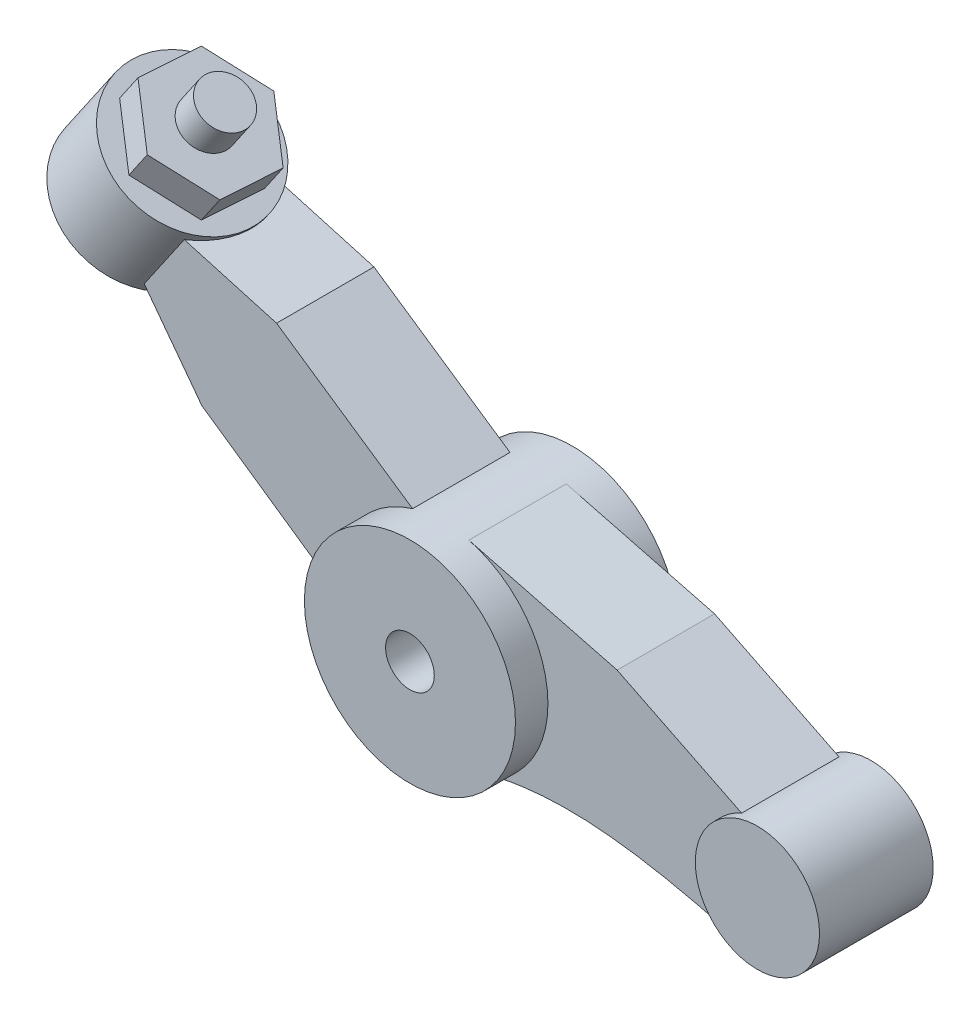
ISO-10303-21;
HEADER;
FILE_DESCRIPTION(('STEP AP214'),'2;1');
FILE_NAME('part.step','',(''),(''),'','','');
FILE_SCHEMA(('AUTOMOTIVE_DESIGN { 1 0 10303 214 1 1 1 1 }'));
ENDSEC;
DATA;
#1=APPLICATION_CONTEXT('core data for automotive mechanical design processes');
#2=APPLICATION_PROTOCOL_DEFINITION('international standard','automotive_design',2000,#1);
#3=PRODUCT_CONTEXT('',#1,'mechanical');
#4=PRODUCT('Part','Part','',(#3));
#5=PRODUCT_RELATED_PRODUCT_CATEGORY('part','',(#4));
#6=PRODUCT_DEFINITION_FORMATION('','',#4);
#7=PRODUCT_DEFINITION_CONTEXT('part definition',#1,'design');
#8=PRODUCT_DEFINITION('design','',#6,#7);
#9=PRODUCT_DEFINITION_SHAPE('','',#8);
#10=(LENGTH_UNIT() NAMED_UNIT(*) SI_UNIT(.MILLI.,.METRE.));
#11=(NAMED_UNIT(*) PLANE_ANGLE_UNIT() SI_UNIT($,.RADIAN.));
#12=(NAMED_UNIT(*) SI_UNIT($,.STERADIAN.) SOLID_ANGLE_UNIT());
#13=UNCERTAINTY_MEASURE_WITH_UNIT(LENGTH_MEASURE(1.E-05),#10,'distance_accuracy_value','');
#14=(GEOMETRIC_REPRESENTATION_CONTEXT(3) GLOBAL_UNCERTAINTY_ASSIGNED_CONTEXT((#13)) GLOBAL_UNIT_ASSIGNED_CONTEXT((#10,
#11,#12)) REPRESENTATION_CONTEXT('',''));
#15=CARTESIAN_POINT('',(0.,0.,0.));
#16=DIRECTION('',(0.,0.,1.));
#17=DIRECTION('',(1.,0.,0.));
#18=AXIS2_PLACEMENT_3D('',#15,#16,#17);
#19=CARTESIAN_POINT('',(-3.24568961540664,3.85924695439901,0.0311809802771275));
#20=DIRECTION('',(-0.565974647839502,-0.824422645251179,0.));
#21=DIRECTION('',(0.824422645251179,-0.565974647839503,0.));
#22=AXIS2_PLACEMENT_3D('',#19,#20,#21);
#23=CYLINDRICAL_SURFACE('',#22,0.3);
#24=CARTESIAN_POINT('',(-3.24568961540664,3.85924695439901,0.0311809802771275));
#25=DIRECTION('',(0.565974647839502,0.824422645251179,0.));
#26=DIRECTION('',(-0.824422645251179,0.565974647839503,0.));
#27=AXIS2_PLACEMENT_3D('',#24,#25,#26);
#28=CIRCLE('',#27,0.3);
#29=CARTESIAN_POINT('',(-3.493016408982,4.02903934875086,0.0311809802771275));
#30=VERTEX_POINT('',#29);
#31=EDGE_CURVE('E11',#30,#30,#28,.T.);
#32=ORIENTED_EDGE('',*,*,#31,.F.);
#33=EDGE_LOOP('',(#32));
#34=FACE_BOUND('',#33,.T.);
#35=CARTESIAN_POINT('',(-3.47207947454244,3.52947789629854,0.0311809802771275));
#36=DIRECTION('',(0.565974647839502,0.824422645251179,0.));
#37=DIRECTION('',(-0.824422645251179,0.565974647839503,0.));
#38=AXIS2_PLACEMENT_3D('',#35,#36,#37);
#39=CIRCLE('',#38,0.3);
#40=CARTESIAN_POINT('',(-3.7194062681178,3.69927029065039,0.0311809802771275));
#41=VERTEX_POINT('',#40);
#42=EDGE_CURVE('E47',#41,#41,#39,.T.);
#43=ORIENTED_EDGE('',*,*,#42,.T.);
#44=EDGE_LOOP('',(#43));
#45=FACE_BOUND('',#44,.T.);
#46=ADVANCED_FACE('F44',(#34,#45),#23,.T.);
#47=CARTESIAN_POINT('',(-3.24568961540664,3.85924695439901,0.0311809802771275));
#48=DIRECTION('',(0.565974647839502,0.824422645251179,0.));
#49=DIRECTION('',(-0.824422645251179,0.565974647839503,0.));
#50=AXIS2_PLACEMENT_3D('',#47,#48,#49);
#51=PLANE('',#50);
#52=ORIENTED_EDGE('',*,*,#31,.T.);
#53=EDGE_LOOP('',(#52));
#54=FACE_BOUND('',#53,.T.);
#55=ADVANCED_FACE('F59',(#54),#51,.T.);
#56=CARTESIAN_POINT('',(-3.47207947454244,3.52947789629854,0.0311809802771275));
#57=DIRECTION('',(0.565974647839502,0.824422645251179,0.));
#58=DIRECTION('',(-0.824422645251179,0.565974647839503,0.));
#59=AXIS2_PLACEMENT_3D('',#56,#57,#58);
#60=PLANE('',#59);
#61=ORIENTED_EDGE('',*,*,#42,.F.);
#62=EDGE_LOOP('',(#61));
#63=FACE_BOUND('',#62,.T.);
#64=ADVANCED_FACE('F57',(#63),#60,.F.);
#65=CLOSED_SHELL('',(#46,#55,#64));
#66=MANIFOLD_SOLID_BREP('B2',#65);
#67=CARTESIAN_POINT('',(-3.48522797726976,3.53850447901504,0.749691266650442));
#68=DIRECTION('',(-0.377487046578813,0.259148750318868,-0.889013754040608));
#69=DIRECTION('',(-0.920459006911347,0.,0.390839118558745));
#70=AXIS2_PLACEMENT_3D('',#67,#68,#69);
#71=PLANE('',#70);
#72=DIRECTION('',(0.732923070770839,-0.503159246367607,-0.457880492188329));
#73=VECTOR('',#72,1.);
#74=CARTESIAN_POINT('',(-3.71161783640557,3.20873542091457,0.749691266650442));
#75=LINE('',#74,#73);
#76=CARTESIAN_POINT('',(-3.71161783640557,3.20873542091457,0.749691266650442));
#77=VERTEX_POINT('',#76);
#78=CARTESIAN_POINT('',(-3.16151850453929,2.8310865566783,0.406026613602348));
#79=VERTEX_POINT('',#78);
#80=EDGE_CURVE('E182',#77,#79,#75,.T.);
#81=ORIENTED_EDGE('',*,*,#80,.T.);
#82=DIRECTION('',(-0.565974647839503,-0.824422645251179,0.));
#83=VECTOR('',#82,1.);
#84=CARTESIAN_POINT('',(-2.93512864540348,3.16085561477877,0.406026613602348));
#85=LINE('',#84,#83);
#86=CARTESIAN_POINT('',(-2.93512864540348,3.16085561477877,0.406026613602348));
#87=VERTEX_POINT('',#86);
#88=EDGE_CURVE('E42',#87,#79,#85,.T.);
#89=ORIENTED_EDGE('',*,*,#88,.F.);
#90=DIRECTION('',(0.732923070770839,-0.503159246367607,-0.457880492188329));
#91=VECTOR('',#90,1.);
#92=CARTESIAN_POINT('',(-3.48522797726976,3.53850447901504,0.749691266650442));
#93=LINE('',#92,#91);
#94=CARTESIAN_POINT('',(-3.48522797726976,3.53850447901504,0.749691266650442));
#95=VERTEX_POINT('',#94);
#96=EDGE_CURVE('E192',#95,#87,#93,.T.);
#97=ORIENTED_EDGE('',*,*,#96,.F.);
#98=DIRECTION('',(-0.565974647839503,-0.824422645251179,0.));
#99=VECTOR('',#98,1.);
#100=CARTESIAN_POINT('',(-3.48522797726976,3.53850447901504,0.749691266650442));
#101=LINE('',#100,#99);
#102=EDGE_CURVE('E178',#95,#77,#101,.T.);
#103=ORIENTED_EDGE('',*,*,#102,.T.);
#104=EDGE_LOOP('',(#81,#89,#97,#103));
#105=FACE_BOUND('',#104,.T.);
#106=ADVANCED_FACE('F98',(#105),#71,.F.);
#107=CARTESIAN_POINT('',(-2.93512864540348,3.16085561477877,0.406026613602348));
#108=DIRECTION('',(-0.823473521596653,0.565323064662815,-0.0479707388878877));
#109=DIRECTION('',(-0.565974647839503,-0.824422645251179,0.));
#110=AXIS2_PLACEMENT_3D('',#107,#108,#109);
#111=PLANE('',#110);
#112=DIRECTION('',(0.0395481634486059,-0.0271502220486731,-0.998848741407101));
#113=VECTOR('',#112,1.);
#114=CARTESIAN_POINT('',(-3.16151850453929,2.8310865566783,0.406026613602348));
#115=LINE('',#114,#113);
#116=CARTESIAN_POINT('',(-3.13183541888237,2.81070881226743,-0.343664653048093));
#117=VERTEX_POINT('',#116);
#118=EDGE_CURVE('E185',#79,#117,#115,.T.);
#119=ORIENTED_EDGE('',*,*,#118,.T.);
#120=DIRECTION('',(-0.565974647839503,-0.824422645251179,0.));
#121=VECTOR('',#120,1.);
#122=CARTESIAN_POINT('',(-2.90544555974657,3.14047787036791,-0.343664653048093));
#123=LINE('',#122,#121);
#124=CARTESIAN_POINT('',(-2.90544555974657,3.14047787036791,-0.343664653048093));
#125=VERTEX_POINT('',#124);
#126=EDGE_CURVE('E106',#125,#117,#123,.T.);
#127=ORIENTED_EDGE('',*,*,#126,.F.);
#128=DIRECTION('',(0.0395481634486059,-0.0271502220486731,-0.998848741407101));
#129=VECTOR('',#128,1.);
#130=CARTESIAN_POINT('',(-2.93512864540348,3.16085561477877,0.406026613602348));
#131=LINE('',#130,#129);
#132=EDGE_CURVE('E151',#87,#125,#131,.T.);
#133=ORIENTED_EDGE('',*,*,#132,.F.);
#134=ORIENTED_EDGE('',*,*,#88,.T.);
#135=EDGE_LOOP('',(#119,#127,#133,#134));
#136=FACE_BOUND('',#135,.T.);
#137=ADVANCED_FACE('F216',(#136),#111,.F.);
#138=CARTESIAN_POINT('',(-2.90544555974657,3.14047787036791,-0.343664653048093));
#139=DIRECTION('',(-0.445986475017839,0.306174314343947,0.841043015152719));
#140=DIRECTION('',(0.8834713126073,0.,0.468485261027424));
#141=AXIS2_PLACEMENT_3D('',#138,#139,#140);
#142=PLANE('',#141);
#143=DIRECTION('',(-0.693374907322231,0.476009024318934,-0.540968249218772));
#144=VECTOR('',#143,1.);
#145=CARTESIAN_POINT('',(-3.13183541888237,2.81070881226743,-0.343664653048093));
#146=LINE('',#145,#144);
#147=CARTESIAN_POINT('',(-3.65225166509174,3.16797993209283,-0.749691266650442));
#148=VERTEX_POINT('',#147);
#149=EDGE_CURVE('E187',#117,#148,#146,.T.);
#150=ORIENTED_EDGE('',*,*,#149,.T.);
#151=DIRECTION('',(-0.565974647839503,-0.824422645251179,0.));
#152=VECTOR('',#151,1.);
#153=CARTESIAN_POINT('',(-3.42586180595594,3.4977489901933,-0.749691266650442));
#154=LINE('',#153,#152);
#155=CARTESIAN_POINT('',(-3.42586180595594,3.4977489901933,-0.749691266650442));
#156=VERTEX_POINT('',#155);
#157=EDGE_CURVE('E173',#156,#148,#154,.T.);
#158=ORIENTED_EDGE('',*,*,#157,.F.);
#159=DIRECTION('',(-0.693374907322231,0.476009024318934,-0.540968249218772));
#160=VECTOR('',#159,1.);
#161=CARTESIAN_POINT('',(-2.90544555974657,3.14047787036791,-0.343664653048093));
#162=LINE('',#161,#160);
#163=EDGE_CURVE('E164',#125,#156,#162,.T.);
#164=ORIENTED_EDGE('',*,*,#163,.F.);
#165=ORIENTED_EDGE('',*,*,#126,.T.);
#166=EDGE_LOOP('',(#150,#158,#164,#165));
#167=FACE_BOUND('',#166,.T.);
#168=ADVANCED_FACE('F198',(#167),#142,.F.);
#169=CARTESIAN_POINT('',(-3.42586180595594,3.4977489901933,-0.749691266650442));
#170=DIRECTION('',(0.377487046578814,-0.259148750318868,0.889013754040607));
#171=DIRECTION('',(0.920459006911347,0.,-0.390839118558745));
#172=AXIS2_PLACEMENT_3D('',#169,#170,#171);
#173=PLANE('',#172);
#174=DIRECTION('',(-0.732923070770838,0.503159246367607,0.457880492188329));
#175=VECTOR('',#174,1.);
#176=CARTESIAN_POINT('',(-3.65225166509174,3.16797993209283,-0.749691266650442));
#177=LINE('',#176,#175);
#178=CARTESIAN_POINT('',(-4.20235099695802,3.54562879632909,-0.406026613602349));
#179=VERTEX_POINT('',#178);
#180=EDGE_CURVE('E172',#148,#179,#177,.T.);
#181=ORIENTED_EDGE('',*,*,#180,.T.);
#182=DIRECTION('',(-0.565974647839503,-0.824422645251179,0.));
#183=VECTOR('',#182,1.);
#184=CARTESIAN_POINT('',(-3.97596113782222,3.87539785442957,-0.406026613602349));
#185=LINE('',#184,#183);
#186=CARTESIAN_POINT('',(-3.97596113782222,3.87539785442957,-0.406026613602349));
#187=VERTEX_POINT('',#186);
#188=EDGE_CURVE('E169',#187,#179,#185,.T.);
#189=ORIENTED_EDGE('',*,*,#188,.F.);
#190=DIRECTION('',(-0.732923070770838,0.503159246367607,0.457880492188329));
#191=VECTOR('',#190,1.);
#192=CARTESIAN_POINT('',(-3.42586180595594,3.4977489901933,-0.749691266650442));
#193=LINE('',#192,#191);
#194=EDGE_CURVE('E158',#156,#187,#193,.T.);
#195=ORIENTED_EDGE('',*,*,#194,.F.);
#196=ORIENTED_EDGE('',*,*,#157,.T.);
#197=EDGE_LOOP('',(#181,#189,#195,#196));
#198=FACE_BOUND('',#197,.T.);
#199=ADVANCED_FACE('F170',(#198),#173,.F.);
#200=CARTESIAN_POINT('',(-3.97596113782222,3.87539785442957,-0.406026613602349));
#201=DIRECTION('',(0.823473521596653,-0.565323064662815,0.0479707388878887));
#202=DIRECTION('',(0.565974647839503,0.824422645251179,0.));
#203=AXIS2_PLACEMENT_3D('',#200,#201,#202);
#204=PLANE('',#203);
#205=DIRECTION('',(-0.0395481634486071,0.0271502220486731,0.998848741407101));
#206=VECTOR('',#205,1.);
#207=CARTESIAN_POINT('',(-4.20235099695802,3.54562879632909,-0.406026613602349));
#208=LINE('',#207,#206);
#209=CARTESIAN_POINT('',(-4.23203408261493,3.56600654073996,0.343664653048093));
#210=VERTEX_POINT('',#209);
#211=EDGE_CURVE('E137',#179,#210,#208,.T.);
#212=ORIENTED_EDGE('',*,*,#211,.T.);
#213=DIRECTION('',(-0.565974647839503,-0.824422645251179,0.));
#214=VECTOR('',#213,1.);
#215=CARTESIAN_POINT('',(-4.00564422347913,3.89577559884043,0.343664653048093));
#216=LINE('',#215,#214);
#217=CARTESIAN_POINT('',(-4.00564422347913,3.89577559884043,0.343664653048093));
#218=VERTEX_POINT('',#217);
#219=EDGE_CURVE('E174',#218,#210,#216,.T.);
#220=ORIENTED_EDGE('',*,*,#219,.F.);
#221=DIRECTION('',(-0.0395481634486071,0.0271502220486731,0.998848741407101));
#222=VECTOR('',#221,1.);
#223=CARTESIAN_POINT('',(-3.97596113782222,3.87539785442957,-0.406026613602349));
#224=LINE('',#223,#222);
#225=EDGE_CURVE('E162',#187,#218,#224,.T.);
#226=ORIENTED_EDGE('',*,*,#225,.F.);
#227=ORIENTED_EDGE('',*,*,#188,.T.);
#228=EDGE_LOOP('',(#212,#220,#226,#227));
#229=FACE_BOUND('',#228,.T.);
#230=ADVANCED_FACE('F176',(#229),#204,.F.);
#231=CARTESIAN_POINT('',(-4.00564422347913,3.89577559884043,0.343664653048093));
#232=DIRECTION('',(0.445986475017839,-0.306174314343947,-0.841043015152719));
#233=DIRECTION('',(-0.8834713126073,0.,-0.468485261027424));
#234=AXIS2_PLACEMENT_3D('',#231,#232,#233);
#235=PLANE('',#234);
#236=DIRECTION('',(0.693374907322231,-0.476009024318934,0.540968249218773));
#237=VECTOR('',#236,1.);
#238=CARTESIAN_POINT('',(-4.23203408261493,3.56600654073996,0.343664653048093));
#239=LINE('',#238,#237);
#240=EDGE_CURVE('E143',#210,#77,#239,.T.);
#241=ORIENTED_EDGE('',*,*,#240,.T.);
#242=ORIENTED_EDGE('',*,*,#102,.F.);
#243=DIRECTION('',(0.693374907322231,-0.476009024318934,0.540968249218773));
#244=VECTOR('',#243,1.);
#245=CARTESIAN_POINT('',(-4.00564422347913,3.89577559884043,0.343664653048093));
#246=LINE('',#245,#244);
#247=EDGE_CURVE('E114',#218,#95,#246,.T.);
#248=ORIENTED_EDGE('',*,*,#247,.F.);
#249=ORIENTED_EDGE('',*,*,#219,.T.);
#250=EDGE_LOOP('',(#241,#242,#248,#249));
#251=FACE_BOUND('',#250,.T.);
#252=ADVANCED_FACE('F205',(#251),#235,.F.);
#253=CARTESIAN_POINT('',(0.534660711402853,0.778809439060978,0.));
#254=DIRECTION('',(0.565974647839502,0.824422645251179,0.));
#255=DIRECTION('',(-0.824422645251179,0.565974647839502,0.));
#256=AXIS2_PLACEMENT_3D('',#253,#254,#255);
#257=PLANE('',#256);
#258=ORIENTED_EDGE('',*,*,#96,.T.);
#259=ORIENTED_EDGE('',*,*,#132,.T.);
#260=ORIENTED_EDGE('',*,*,#163,.T.);
#261=ORIENTED_EDGE('',*,*,#194,.T.);
#262=ORIENTED_EDGE('',*,*,#225,.T.);
#263=ORIENTED_EDGE('',*,*,#247,.T.);
#264=EDGE_LOOP('',(#258,#259,#260,#261,#262,#263));
#265=FACE_BOUND('',#264,.T.);
#266=ADVANCED_FACE('F160',(#265),#257,.T.);
#267=CARTESIAN_POINT('',(0.308270852267052,0.449040380960506,0.));
#268=DIRECTION('',(0.565974647839502,0.824422645251179,0.));
#269=DIRECTION('',(-0.824422645251179,0.565974647839502,0.));
#270=AXIS2_PLACEMENT_3D('',#267,#268,#269);
#271=PLANE('',#270);
#272=ORIENTED_EDGE('',*,*,#80,.F.);
#273=ORIENTED_EDGE('',*,*,#240,.F.);
#274=ORIENTED_EDGE('',*,*,#211,.F.);
#275=ORIENTED_EDGE('',*,*,#180,.F.);
#276=ORIENTED_EDGE('',*,*,#149,.F.);
#277=ORIENTED_EDGE('',*,*,#118,.F.);
#278=EDGE_LOOP('',(#272,#273,#274,#275,#276,#277));
#279=FACE_BOUND('',#278,.T.);
#280=ADVANCED_FACE('F201',(#279),#271,.F.);
#281=CLOSED_SHELL('',(#106,#137,#168,#199,#230,#252,#266,#280));
#282=MANIFOLD_SOLID_BREP('B6',#281);
#283=CARTESIAN_POINT('',(0.,0.,1.));
#284=DIRECTION('',(0.,0.,-1.));
#285=DIRECTION('',(-1.,0.,0.));
#286=AXIS2_PLACEMENT_3D('',#283,#284,#285);
#287=CYLINDRICAL_SURFACE('',#286,0.3);
#288=CARTESIAN_POINT('',(0.,0.,1.));
#289=DIRECTION('',(0.,0.,1.));
#290=DIRECTION('',(1.,0.,0.));
#291=AXIS2_PLACEMENT_3D('',#288,#289,#290);
#292=CIRCLE('',#291,0.3);
#293=CARTESIAN_POINT('',(0.3,0.,1.));
#294=VERTEX_POINT('',#293);
#295=EDGE_CURVE('E455',#294,#294,#292,.T.);
#296=ORIENTED_EDGE('',*,*,#295,.T.);
#297=EDGE_LOOP('',(#296));
#298=FACE_BOUND('',#297,.T.);
#299=CARTESIAN_POINT('',(0.,0.,-1.));
#300=DIRECTION('',(0.,0.,1.));
#301=DIRECTION('',(1.,0.,0.));
#302=AXIS2_PLACEMENT_3D('',#299,#300,#301);
#303=CIRCLE('',#302,0.3);
#304=CARTESIAN_POINT('',(0.3,0.,-1.));
#305=VERTEX_POINT('',#304);
#306=EDGE_CURVE('E456',#305,#305,#303,.T.);
#307=ORIENTED_EDGE('',*,*,#306,.F.);
#308=EDGE_LOOP('',(#307));
#309=FACE_BOUND('',#308,.T.);
#310=ADVANCED_FACE('F286',(#298,#309),#287,.F.);
#311=CARTESIAN_POINT('',(0.,0.,1.));
#312=DIRECTION('',(0.,0.,-1.));
#313=DIRECTION('',(-1.,0.,0.));
#314=AXIS2_PLACEMENT_3D('',#311,#312,#313);
#315=CYLINDRICAL_SURFACE('',#314,1.3);
#316=DIRECTION('',(0.,0.,-1.));
#317=VECTOR('',#316,1.);
#318=CARTESIAN_POINT('',(-0.367546709514205,1.2469600700605,0.6));
#319=LINE('',#318,#317);
#320=CARTESIAN_POINT('',(-0.367546709514206,1.2469600700605,0.6));
#321=VERTEX_POINT('',#320);
#322=CARTESIAN_POINT('',(-0.367546709514206,1.2469600700605,-0.6));
#323=VERTEX_POINT('',#322);
#324=EDGE_CURVE('E308',#321,#323,#319,.T.);
#325=ORIENTED_EDGE('',*,*,#324,.F.);
#326=CARTESIAN_POINT('',(0.,0.,0.6));
#327=DIRECTION('',(0.,0.,1.));
#328=DIRECTION('',(1.,0.,0.));
#329=AXIS2_PLACEMENT_3D('',#326,#327,#328);
#330=CIRCLE('',#329,1.3);
#331=CARTESIAN_POINT('',(-1.29574513197099,-0.105093068151436,0.6));
#332=VERTEX_POINT('',#331);
#333=EDGE_CURVE('E389',#321,#332,#330,.T.);
#334=ORIENTED_EDGE('',*,*,#333,.T.);
#335=DIRECTION('',(0.,0.,-1.));
#336=VECTOR('',#335,1.);
#337=CARTESIAN_POINT('',(-1.29574513197099,-0.105093068151436,0.6));
#338=LINE('',#337,#336);
#339=CARTESIAN_POINT('',(-1.29574513197099,-0.105093068151436,-0.6));
#340=VERTEX_POINT('',#339);
#341=EDGE_CURVE('E395',#332,#340,#338,.T.);
#342=ORIENTED_EDGE('',*,*,#341,.T.);
#343=CARTESIAN_POINT('',(0.,0.,-0.6));
#344=DIRECTION('',(0.,0.,1.));
#345=DIRECTION('',(1.,0.,0.));
#346=AXIS2_PLACEMENT_3D('',#343,#344,#345);
#347=CIRCLE('',#346,1.3);
#348=EDGE_CURVE('E593',#323,#340,#347,.T.);
#349=ORIENTED_EDGE('',*,*,#348,.F.);
#350=EDGE_LOOP('',(#325,#334,#342,#349));
#351=FACE_BOUND('',#350,.T.);
#352=DIRECTION('',(0.,0.,-1.));
#353=VECTOR('',#352,1.);
#354=CARTESIAN_POINT('',(0.709115587174983,-1.08956646608891,0.6));
#355=LINE('',#354,#353);
#356=CARTESIAN_POINT('',(0.709115587174983,-1.08956646608891,0.6));
#357=VERTEX_POINT('',#356);
#358=CARTESIAN_POINT('',(0.709115587174983,-1.08956646608891,-0.6));
#359=VERTEX_POINT('',#358);
#360=EDGE_CURVE('E447',#357,#359,#355,.T.);
#361=ORIENTED_EDGE('',*,*,#360,.F.);
#362=CARTESIAN_POINT('',(0.,0.,0.6));
#363=DIRECTION('',(0.,0.,1.));
#364=DIRECTION('',(1.,0.,0.));
#365=AXIS2_PLACEMENT_3D('',#362,#363,#364);
#366=CIRCLE('',#365,1.3);
#367=CARTESIAN_POINT('',(0.325958313102532,1.25847176294081,0.6));
#368=VERTEX_POINT('',#367);
#369=EDGE_CURVE('E474',#357,#368,#366,.T.);
#370=ORIENTED_EDGE('',*,*,#369,.T.);
#371=DIRECTION('',(0.,0.,-1.));
#372=VECTOR('',#371,1.);
#373=CARTESIAN_POINT('',(0.325958313102531,1.25847176294081,0.6));
#374=LINE('',#373,#372);
#375=CARTESIAN_POINT('',(0.325958313102531,1.25847176294081,-0.6));
#376=VERTEX_POINT('',#375);
#377=EDGE_CURVE('E471',#368,#376,#374,.T.);
#378=ORIENTED_EDGE('',*,*,#377,.T.);
#379=CARTESIAN_POINT('',(0.,0.,-0.6));
#380=DIRECTION('',(0.,0.,1.));
#381=DIRECTION('',(1.,0.,0.));
#382=AXIS2_PLACEMENT_3D('',#379,#380,#381);
#383=CIRCLE('',#382,1.3);
#384=EDGE_CURVE('E418',#359,#376,#383,.T.);
#385=ORIENTED_EDGE('',*,*,#384,.F.);
#386=EDGE_LOOP('',(#361,#370,#378,#385));
#387=FACE_BOUND('',#386,.T.);
#388=CARTESIAN_POINT('',(0.,0.,1.));
#389=DIRECTION('',(0.,0.,1.));
#390=DIRECTION('',(1.,0.,0.));
#391=AXIS2_PLACEMENT_3D('',#388,#389,#390);
#392=CIRCLE('',#391,1.3);
#393=CARTESIAN_POINT('',(1.3,0.,1.));
#394=VERTEX_POINT('',#393);
#395=EDGE_CURVE('E294',#394,#394,#392,.T.);
#396=ORIENTED_EDGE('',*,*,#395,.F.);
#397=EDGE_LOOP('',(#396));
#398=FACE_BOUND('',#397,.T.);
#399=CARTESIAN_POINT('',(0.,0.,-1.));
#400=DIRECTION('',(0.,0.,1.));
#401=DIRECTION('',(1.,0.,0.));
#402=AXIS2_PLACEMENT_3D('',#399,#400,#401);
#403=CIRCLE('',#402,1.3);
#404=CARTESIAN_POINT('',(1.3,0.,-1.));
#405=VERTEX_POINT('',#404);
#406=EDGE_CURVE('E453',#405,#405,#403,.T.);
#407=ORIENTED_EDGE('',*,*,#406,.T.);
#408=EDGE_LOOP('',(#407));
#409=FACE_BOUND('',#408,.T.);
#410=ADVANCED_FACE('F435',(#351,#387,#398,#409),#315,.T.);
#411=CARTESIAN_POINT('',(0.,0.,1.));
#412=DIRECTION('',(0.,0.,1.));
#413=DIRECTION('',(1.,0.,0.));
#414=AXIS2_PLACEMENT_3D('',#411,#412,#413);
#415=PLANE('',#414);
#416=ORIENTED_EDGE('',*,*,#295,.F.);
#417=EDGE_LOOP('',(#416));
#418=FACE_BOUND('',#417,.T.);
#419=ORIENTED_EDGE('',*,*,#395,.T.);
#420=EDGE_LOOP('',(#419));
#421=FACE_BOUND('',#420,.T.);
#422=ADVANCED_FACE('F432',(#418,#421),#415,.T.);
#423=CARTESIAN_POINT('',(0.,0.,-1.));
#424=DIRECTION('',(0.,0.,1.));
#425=DIRECTION('',(1.,0.,0.));
#426=AXIS2_PLACEMENT_3D('',#423,#424,#425);
#427=PLANE('',#426);
#428=ORIENTED_EDGE('',*,*,#306,.T.);
#429=EDGE_LOOP('',(#428));
#430=FACE_BOUND('',#429,.T.);
#431=ORIENTED_EDGE('',*,*,#406,.F.);
#432=EDGE_LOOP('',(#431));
#433=FACE_BOUND('',#432,.T.);
#434=ADVANCED_FACE('F429',(#430,#433),#427,.F.);
#435=CARTESIAN_POINT('',(3.57994332704498,-1.3320580176826,0.6));
#436=CARTESIAN_POINT('',(2.65154922605074,-1.08624133933173,0.6));
#437=CARTESIAN_POINT('',(1.67007562675772,-0.883873744552403,0.6));
#438=CARTESIAN_POINT('',(0.709115587174983,-1.08956646608891,0.6));
#439=B_SPLINE_CURVE_WITH_KNOTS('',3,(#435,#436,#437,#438),.UNSPECIFIED.,.F.,.F.,(4,4),(0.,1.),.UNSPECIFIED.);
#440=DIRECTION('',(0.,0.,-1.));
#441=VECTOR('',#440,1.);
#442=SURFACE_OF_LINEAR_EXTRUSION('',#439,#441);
#443=CARTESIAN_POINT('',(3.57994332704498,-1.3320580176826,-0.6));
#444=CARTESIAN_POINT('',(2.65154922605074,-1.08624133933173,-0.6));
#445=CARTESIAN_POINT('',(1.67007562675772,-0.883873744552403,-0.6));
#446=CARTESIAN_POINT('',(0.709115587174983,-1.08956646608891,-0.6));
#447=B_SPLINE_CURVE_WITH_KNOTS('',3,(#443,#444,#445,#446),.UNSPECIFIED.,.F.,.F.,(4,4),(0.,1.),.UNSPECIFIED.);
#448=CARTESIAN_POINT('',(3.57994332704498,-1.3320580176826,-0.6));
#449=VERTEX_POINT('',#448);
#450=EDGE_CURVE('E408',#449,#359,#447,.T.);
#451=ORIENTED_EDGE('',*,*,#450,.F.);
#452=DIRECTION('',(0.,0.,-1.));
#453=VECTOR('',#452,1.);
#454=CARTESIAN_POINT('',(3.57994332704498,-1.3320580176826,0.6));
#455=LINE('',#454,#453);
#456=CARTESIAN_POINT('',(3.57994332704498,-1.3320580176826,0.6));
#457=VERTEX_POINT('',#456);
#458=EDGE_CURVE('E461',#457,#449,#455,.T.);
#459=ORIENTED_EDGE('',*,*,#458,.F.);
#460=EDGE_CURVE('E411',#457,#357,#439,.T.);
#461=ORIENTED_EDGE('',*,*,#460,.T.);
#462=ORIENTED_EDGE('',*,*,#360,.T.);
#463=EDGE_LOOP('',(#451,#459,#461,#462));
#464=FACE_BOUND('',#463,.T.);
#465=ADVANCED_FACE('F424',(#464),#442,.T.);
#466=CARTESIAN_POINT('',(0.736206935641838,1.48668084623999,0.6));
#467=DIRECTION('',(0.443770352750876,0.896140543675691,0.));
#468=DIRECTION('',(-0.896140543675691,0.443770352750876,0.));
#469=AXIS2_PLACEMENT_3D('',#466,#467,#468);
#470=PLANE('',#469);
#471=DIRECTION('',(0.896140543675691,-0.443770352750876,0.));
#472=VECTOR('',#471,1.);
#473=CARTESIAN_POINT('',(0.736206935641838,1.48668084623999,-0.6));
#474=LINE('',#473,#472);
#475=CARTESIAN_POINT('',(2.15230142930779,0.785428394916758,-0.6));
#476=VERTEX_POINT('',#475);
#477=CARTESIAN_POINT('',(3.68565807651775,0.0261075216146396,-0.6));
#478=VERTEX_POINT('',#477);
#479=EDGE_CURVE('E480',#476,#478,#474,.T.);
#480=ORIENTED_EDGE('',*,*,#479,.F.);
#481=DIRECTION('',(0.,0.,-1.));
#482=VECTOR('',#481,1.);
#483=CARTESIAN_POINT('',(2.15230142930779,0.785428394916758,0.6));
#484=LINE('',#483,#482);
#485=CARTESIAN_POINT('',(2.15230142930779,0.785428394916758,0.6));
#486=VERTEX_POINT('',#485);
#487=EDGE_CURVE('E469',#486,#476,#484,.T.);
#488=ORIENTED_EDGE('',*,*,#487,.F.);
#489=DIRECTION('',(0.896140543675691,-0.443770352750876,0.));
#490=VECTOR('',#489,1.);
#491=CARTESIAN_POINT('',(0.736206935641838,1.48668084623999,0.6));
#492=LINE('',#491,#490);
#493=CARTESIAN_POINT('',(3.68565807651775,0.0261075216146395,0.6));
#494=VERTEX_POINT('',#493);
#495=EDGE_CURVE('E496',#486,#494,#492,.T.);
#496=ORIENTED_EDGE('',*,*,#495,.T.);
#497=DIRECTION('',(0.,0.,-1.));
#498=VECTOR('',#497,1.);
#499=CARTESIAN_POINT('',(3.68565807651775,0.0261075216146395,0.6));
#500=LINE('',#499,#498);
#501=EDGE_CURVE('E466',#494,#478,#500,.T.);
#502=ORIENTED_EDGE('',*,*,#501,.T.);
#503=EDGE_LOOP('',(#480,#488,#496,#502));
#504=FACE_BOUND('',#503,.T.);
#505=ADVANCED_FACE('F428',(#504),#470,.T.);
#506=CARTESIAN_POINT('',(0.325958313102531,1.25847176294081,0.6));
#507=DIRECTION('',(0.250737163925024,0.968055202262162,0.));
#508=DIRECTION('',(-0.968055202262162,0.250737163925024,0.));
#509=AXIS2_PLACEMENT_3D('',#506,#507,#508);
#510=PLANE('',#509);
#511=DIRECTION('',(0.968055202262162,-0.250737163925024,0.));
#512=VECTOR('',#511,1.);
#513=CARTESIAN_POINT('',(0.325958313102531,1.25847176294081,-0.6));
#514=LINE('',#513,#512);
#515=EDGE_CURVE('E477',#376,#476,#514,.T.);
#516=ORIENTED_EDGE('',*,*,#515,.F.);
#517=ORIENTED_EDGE('',*,*,#377,.F.);
#518=DIRECTION('',(0.968055202262162,-0.250737163925024,0.));
#519=VECTOR('',#518,1.);
#520=CARTESIAN_POINT('',(0.325958313102531,1.25847176294081,0.6));
#521=LINE('',#520,#519);
#522=EDGE_CURVE('E494',#368,#486,#521,.T.);
#523=ORIENTED_EDGE('',*,*,#522,.T.);
#524=ORIENTED_EDGE('',*,*,#487,.T.);
#525=EDGE_LOOP('',(#516,#517,#523,#524));
#526=FACE_BOUND('',#525,.T.);
#527=ADVANCED_FACE('F514',(#526),#510,.T.);
#528=CARTESIAN_POINT('',(0.,0.,0.6));
#529=DIRECTION('',(0.,0.,1.));
#530=DIRECTION('',(1.,0.,0.));
#531=AXIS2_PLACEMENT_3D('',#528,#529,#530);
#532=PLANE('',#531);
#533=ORIENTED_EDGE('',*,*,#460,.F.);
#534=CARTESIAN_POINT('',(3.98,-0.68,0.6));
#535=DIRECTION('',(0.,0.,1.));
#536=DIRECTION('',(1.,0.,0.));
#537=AXIS2_PLACEMENT_3D('',#534,#535,#536);
#538=CIRCLE('',#537,0.765);
#539=EDGE_CURVE('E417',#494,#457,#538,.T.);
#540=ORIENTED_EDGE('',*,*,#539,.F.);
#541=ORIENTED_EDGE('',*,*,#495,.F.);
#542=ORIENTED_EDGE('',*,*,#522,.F.);
#543=ORIENTED_EDGE('',*,*,#369,.F.);
#544=EDGE_LOOP('',(#533,#540,#541,#542,#543));
#545=FACE_BOUND('',#544,.T.);
#546=ADVANCED_FACE('F509',(#545),#532,.T.);
#547=CARTESIAN_POINT('',(0.,0.,-0.6));
#548=DIRECTION('',(0.,0.,1.));
#549=DIRECTION('',(1.,0.,0.));
#550=AXIS2_PLACEMENT_3D('',#547,#548,#549);
#551=PLANE('',#550);
#552=ORIENTED_EDGE('',*,*,#450,.T.);
#553=ORIENTED_EDGE('',*,*,#384,.T.);
#554=ORIENTED_EDGE('',*,*,#515,.T.);
#555=ORIENTED_EDGE('',*,*,#479,.T.);
#556=CARTESIAN_POINT('',(3.98,-0.68,-0.6));
#557=DIRECTION('',(0.,0.,1.));
#558=DIRECTION('',(1.,0.,0.));
#559=AXIS2_PLACEMENT_3D('',#556,#557,#558);
#560=CIRCLE('',#559,0.765);
#561=EDGE_CURVE('E483',#478,#449,#560,.T.);
#562=ORIENTED_EDGE('',*,*,#561,.T.);
#563=EDGE_LOOP('',(#552,#553,#554,#555,#562));
#564=FACE_BOUND('',#563,.T.);
#565=ADVANCED_FACE('F517',(#564),#551,.F.);
#566=CARTESIAN_POINT('',(3.98,-0.68,0.7));
#567=DIRECTION('',(0.,0.,-1.));
#568=DIRECTION('',(-1.,0.,0.));
#569=AXIS2_PLACEMENT_3D('',#566,#567,#568);
#570=CYLINDRICAL_SURFACE('',#569,0.765);
#571=ORIENTED_EDGE('',*,*,#539,.T.);
#572=ORIENTED_EDGE('',*,*,#458,.T.);
#573=ORIENTED_EDGE('',*,*,#561,.F.);
#574=ORIENTED_EDGE('',*,*,#501,.F.);
#575=EDGE_LOOP('',(#571,#572,#573,#574));
#576=FACE_BOUND('',#575,.T.);
#577=CARTESIAN_POINT('',(3.98,-0.68,0.7));
#578=DIRECTION('',(0.,0.,1.));
#579=DIRECTION('',(1.,0.,0.));
#580=AXIS2_PLACEMENT_3D('',#577,#578,#579);
#581=CIRCLE('',#580,0.765);
#582=CARTESIAN_POINT('',(4.745,-0.68,0.7));
#583=VERTEX_POINT('',#582);
#584=EDGE_CURVE('E405',#583,#583,#581,.T.);
#585=ORIENTED_EDGE('',*,*,#584,.F.);
#586=EDGE_LOOP('',(#585));
#587=FACE_BOUND('',#586,.T.);
#588=CARTESIAN_POINT('',(3.98,-0.68,-0.7));
#589=DIRECTION('',(0.,0.,1.));
#590=DIRECTION('',(1.,0.,0.));
#591=AXIS2_PLACEMENT_3D('',#588,#589,#590);
#592=CIRCLE('',#591,0.765);
#593=CARTESIAN_POINT('',(4.745,-0.68,-0.7));
#594=VERTEX_POINT('',#593);
#595=EDGE_CURVE('E404',#594,#594,#592,.T.);
#596=ORIENTED_EDGE('',*,*,#595,.T.);
#597=EDGE_LOOP('',(#596));
#598=FACE_BOUND('',#597,.T.);
#599=ADVANCED_FACE('F503',(#576,#587,#598),#570,.T.);
#600=CARTESIAN_POINT('',(0.,0.,0.7));
#601=DIRECTION('',(0.,0.,1.));
#602=DIRECTION('',(1.,0.,0.));
#603=AXIS2_PLACEMENT_3D('',#600,#601,#602);
#604=PLANE('',#603);
#605=ORIENTED_EDGE('',*,*,#584,.T.);
#606=EDGE_LOOP('',(#605));
#607=FACE_BOUND('',#606,.T.);
#608=ADVANCED_FACE('F531',(#607),#604,.T.);
#609=CARTESIAN_POINT('',(0.,0.,-0.7));
#610=DIRECTION('',(0.,0.,1.));
#611=DIRECTION('',(1.,0.,0.));
#612=AXIS2_PLACEMENT_3D('',#609,#610,#611);
#613=PLANE('',#612);
#614=ORIENTED_EDGE('',*,*,#595,.F.);
#615=EDGE_LOOP('',(#614));
#616=FACE_BOUND('',#615,.T.);
#617=ADVANCED_FACE('F532',(#616),#613,.F.);
#618=CARTESIAN_POINT('',(0.463716114633788,0.680553558032619,0.6));
#619=DIRECTION('',(0.56309004389854,0.826395548428439,0.));
#620=DIRECTION('',(-0.826395548428439,0.56309004389854,0.));
#621=AXIS2_PLACEMENT_3D('',#618,#619,#620);
#622=PLANE('',#621);
#623=DIRECTION('',(0.826395548428439,-0.56309004389854,0.));
#624=VECTOR('',#623,1.);
#625=CARTESIAN_POINT('',(0.463716114633788,0.680553558032619,-0.6));
#626=LINE('',#625,#624);
#627=CARTESIAN_POINT('',(-2.04276380236819,2.38842080051653,-0.6));
#628=VERTEX_POINT('',#627);
#629=EDGE_CURVE('E391',#628,#323,#626,.T.);
#630=ORIENTED_EDGE('',*,*,#629,.F.);
#631=DIRECTION('',(0.,0.,-1.));
#632=VECTOR('',#631,1.);
#633=CARTESIAN_POINT('',(-2.04276380236819,2.38842080051653,0.6));
#634=LINE('',#633,#632);
#635=CARTESIAN_POINT('',(-2.04276380236819,2.38842080051653,0.6));
#636=VERTEX_POINT('',#635);
#637=EDGE_CURVE('E400',#636,#628,#634,.T.);
#638=ORIENTED_EDGE('',*,*,#637,.F.);
#639=DIRECTION('',(0.826395548428439,-0.56309004389854,0.));
#640=VECTOR('',#639,1.);
#641=CARTESIAN_POINT('',(0.463716114633788,0.680553558032619,0.6));
#642=LINE('',#641,#640);
#643=EDGE_CURVE('E595',#636,#321,#642,.T.);
#644=ORIENTED_EDGE('',*,*,#643,.T.);
#645=ORIENTED_EDGE('',*,*,#324,.T.);
#646=EDGE_LOOP('',(#630,#638,#644,#645));
#647=FACE_BOUND('',#646,.T.);
#648=ADVANCED_FACE('F535',(#647),#622,.T.);
#649=CARTESIAN_POINT('',(0.475246926218136,1.67323192497303,0.6));
#650=DIRECTION('',(0.27322226875085,0.961950930067973,0.));
#651=DIRECTION('',(-0.961950930067973,0.27322226875085,0.));
#652=AXIS2_PLACEMENT_3D('',#649,#650,#651);
#653=PLANE('',#652);
#654=CARTESIAN_POINT('',(-3.87402397130529,2.90855238144312,0.));
#655=DIRECTION('',(0.27322226875085,0.961950930067973,0.));
#656=DIRECTION('',(0.961950930067973,-0.27322226875085,0.));
#657=AXIS2_PLACEMENT_3D('',#654,#655,#656);
#658=ELLIPSE('',#657,0.960228589909435,0.91);
#659=CARTESIAN_POINT('',(-3.17955078912574,2.71130163559861,0.6));
#660=VERTEX_POINT('',#659);
#661=CARTESIAN_POINT('',(-3.17955078912574,2.71130163559861,-0.6));
#662=VERTEX_POINT('',#661);
#663=EDGE_CURVE('E301',#660,#662,#658,.T.);
#664=ORIENTED_EDGE('',*,*,#663,.F.);
#665=DIRECTION('',(0.961950930067973,-0.27322226875085,0.));
#666=VECTOR('',#665,1.);
#667=CARTESIAN_POINT('',(0.475246926218136,1.67323192497303,0.6));
#668=LINE('',#667,#666);
#669=EDGE_CURVE('E598',#660,#636,#668,.T.);
#670=ORIENTED_EDGE('',*,*,#669,.T.);
#671=ORIENTED_EDGE('',*,*,#637,.T.);
#672=DIRECTION('',(0.961950930067973,-0.27322226875085,0.));
#673=VECTOR('',#672,1.);
#674=CARTESIAN_POINT('',(0.475246926218136,1.67323192497303,-0.6));
#675=LINE('',#674,#673);
#676=EDGE_CURVE('E387',#662,#628,#675,.T.);
#677=ORIENTED_EDGE('',*,*,#676,.F.);
#678=EDGE_LOOP('',(#664,#670,#671,#677));
#679=FACE_BOUND('',#678,.T.);
#680=ADVANCED_FACE('F542',(#679),#653,.T.);
#681=CARTESIAN_POINT('',(-1.39068998895331,-1.04477082188093,0.6));
#682=DIRECTION('',(0.799515899944011,0.600644924840557,0.));
#683=DIRECTION('',(-0.600644924840557,0.799515899944011,0.));
#684=AXIS2_PLACEMENT_3D('',#681,#682,#683);
#685=PLANE('',#684);
#686=DIRECTION('',(0.600644924840557,-0.799515899944011,0.));
#687=VECTOR('',#686,1.);
#688=CARTESIAN_POINT('',(-1.39068998895331,-1.04477082188093,0.6));
#689=LINE('',#688,#687);
#690=CARTESIAN_POINT('',(-3.67275618424775,1.99287776617126,0.6));
#691=VERTEX_POINT('',#690);
#692=CARTESIAN_POINT('',(-2.9629431232297,1.04804862535648,0.6));
#693=VERTEX_POINT('',#692);
#694=EDGE_CURVE('E379',#691,#693,#689,.T.);
#695=ORIENTED_EDGE('',*,*,#694,.F.);
#696=CARTESIAN_POINT('',(-4.10638723472612,2.57008220964327,0.));
#697=DIRECTION('',(0.799515899944011,0.600644924840557,0.));
#698=DIRECTION('',(-0.600644924840557,0.799515899944011,0.));
#699=AXIS2_PLACEMENT_3D('',#696,#697,#698);
#700=ELLIPSE('',#699,0.960228589909435,0.91);
#701=CARTESIAN_POINT('',(-3.67275618424775,1.99287776617126,-0.6));
#702=VERTEX_POINT('',#701);
#703=EDGE_CURVE('E368',#691,#702,#700,.T.);
#704=ORIENTED_EDGE('',*,*,#703,.T.);
#705=DIRECTION('',(0.600644924840557,-0.799515899944011,0.));
#706=VECTOR('',#705,1.);
#707=CARTESIAN_POINT('',(-1.39068998895331,-1.04477082188093,-0.6));
#708=LINE('',#707,#706);
#709=CARTESIAN_POINT('',(-2.9629431232297,1.04804862535648,-0.6));
#710=VERTEX_POINT('',#709);
#711=EDGE_CURVE('E377',#702,#710,#708,.T.);
#712=ORIENTED_EDGE('',*,*,#711,.T.);
#713=DIRECTION('',(0.,0.,-1.));
#714=VECTOR('',#713,1.);
#715=CARTESIAN_POINT('',(-2.9629431232297,1.04804862535648,0.6));
#716=LINE('',#715,#714);
#717=EDGE_CURVE('E397',#693,#710,#716,.T.);
#718=ORIENTED_EDGE('',*,*,#717,.F.);
#719=EDGE_LOOP('',(#695,#704,#712,#718));
#720=FACE_BOUND('',#719,.T.);
#721=ADVANCED_FACE('F375',(#720),#685,.F.);
#722=CARTESIAN_POINT('',(-0.468461482264123,-0.677295814217699,0.6));
#723=DIRECTION('',(0.568852339369746,0.822439673163672,0.));
#724=DIRECTION('',(-0.822439673163672,0.568852339369746,0.));
#725=AXIS2_PLACEMENT_3D('',#722,#723,#724);
#726=PLANE('',#725);
#727=DIRECTION('',(0.822439673163672,-0.568852339369746,0.));
#728=VECTOR('',#727,1.);
#729=CARTESIAN_POINT('',(-0.468461482264123,-0.677295814217699,-0.6));
#730=LINE('',#729,#728);
#731=EDGE_CURVE('E386',#710,#340,#730,.T.);
#732=ORIENTED_EDGE('',*,*,#731,.T.);
#733=ORIENTED_EDGE('',*,*,#341,.F.);
#734=DIRECTION('',(0.822439673163672,-0.568852339369746,0.));
#735=VECTOR('',#734,1.);
#736=CARTESIAN_POINT('',(-0.468461482264123,-0.677295814217699,0.6));
#737=LINE('',#736,#735);
#738=EDGE_CURVE('E398',#693,#332,#737,.T.);
#739=ORIENTED_EDGE('',*,*,#738,.F.);
#740=ORIENTED_EDGE('',*,*,#717,.T.);
#741=EDGE_LOOP('',(#732,#733,#739,#740));
#742=FACE_BOUND('',#741,.T.);
#743=ADVANCED_FACE('F549',(#742),#726,.F.);
#744=CARTESIAN_POINT('',(0.,0.,0.6));
#745=DIRECTION('',(0.,0.,1.));
#746=DIRECTION('',(1.,0.,0.));
#747=AXIS2_PLACEMENT_3D('',#744,#745,#746);
#748=PLANE('',#747);
#749=DIRECTION('',(0.565974647839503,0.824422645251179,0.));
#750=VECTOR('',#749,1.);
#751=CARTESIAN_POINT('',(-3.11788263441969,2.80113008184544,0.6));
#752=LINE('',#751,#750);
#753=EDGE_CURVE('E591',#691,#660,#752,.T.);
#754=ORIENTED_EDGE('',*,*,#753,.F.);
#755=ORIENTED_EDGE('',*,*,#694,.T.);
#756=ORIENTED_EDGE('',*,*,#738,.T.);
#757=ORIENTED_EDGE('',*,*,#333,.F.);
#758=ORIENTED_EDGE('',*,*,#643,.F.);
#759=ORIENTED_EDGE('',*,*,#669,.F.);
#760=EDGE_LOOP('',(#754,#755,#756,#757,#758,#759));
#761=FACE_BOUND('',#760,.T.);
#762=ADVANCED_FACE('F552',(#761),#748,.T.);
#763=CARTESIAN_POINT('',(0.,0.,-0.6));
#764=DIRECTION('',(0.,0.,1.));
#765=DIRECTION('',(1.,0.,0.));
#766=AXIS2_PLACEMENT_3D('',#763,#764,#765);
#767=PLANE('',#766);
#768=ORIENTED_EDGE('',*,*,#711,.F.);
#769=DIRECTION('',(0.565974647839503,0.824422645251179,0.));
#770=VECTOR('',#769,1.);
#771=CARTESIAN_POINT('',(-3.11788263441969,2.80113008184544,-0.6));
#772=LINE('',#771,#770);
#773=EDGE_CURVE('E96',#702,#662,#772,.T.);
#774=ORIENTED_EDGE('',*,*,#773,.T.);
#775=ORIENTED_EDGE('',*,*,#676,.T.);
#776=ORIENTED_EDGE('',*,*,#629,.T.);
#777=ORIENTED_EDGE('',*,*,#348,.T.);
#778=ORIENTED_EDGE('',*,*,#731,.F.);
#779=EDGE_LOOP('',(#768,#774,#775,#776,#777,#778));
#780=FACE_BOUND('',#779,.T.);
#781=ADVANCED_FACE('F383',(#780),#767,.F.);
#782=CARTESIAN_POINT('',(-4.43215935792723,3.70339460603764,0.));
#783=DIRECTION('',(0.565974647839503,0.824422645251179,0.));
#784=DIRECTION('',(-0.824422645251179,0.565974647839503,0.));
#785=AXIS2_PLACEMENT_3D('',#782,#783,#784);
#786=PLANE('',#785);
#787=CARTESIAN_POINT('',(-3.68193475074865,3.1883576765037,0.));
#788=DIRECTION('',(0.565974647839503,0.824422645251179,0.));
#789=DIRECTION('',(-0.824422645251179,0.565974647839503,0.));
#790=AXIS2_PLACEMENT_3D('',#787,#788,#789);
#791=CIRCLE('',#790,0.91);
#792=CARTESIAN_POINT('',(-4.43215935792723,3.70339460603764,0.));
#793=VERTEX_POINT('',#792);
#794=EDGE_CURVE('E584',#793,#793,#791,.T.);
#795=ORIENTED_EDGE('',*,*,#794,.T.);
#796=EDGE_LOOP('',(#795));
#797=FACE_BOUND('',#796,.T.);
#798=ADVANCED_FACE('F556',(#797),#786,.T.);
#799=CARTESIAN_POINT('',(-4.29318737041532,2.29798121963242,0.));
#800=DIRECTION('',(-0.565974647839503,-0.824422645251179,0.));
#801=DIRECTION('',(0.824422645251179,-0.565974647839503,0.));
#802=AXIS2_PLACEMENT_3D('',#799,#800,#801);
#803=PLANE('',#802);
#804=CARTESIAN_POINT('',(-4.29318737041532,2.29798121963242,0.));
#805=DIRECTION('',(-0.565974647839503,-0.824422645251179,0.));
#806=DIRECTION('',(0.824422645251179,-0.565974647839503,0.));
#807=AXIS2_PLACEMENT_3D('',#804,#805,#806);
#808=CIRCLE('',#807,0.311333881209341);
#809=CARTESIAN_POINT('',(-4.0365166685124,2.12177413585446,0.));
#810=VERTEX_POINT('',#809);
#811=EDGE_CURVE('E289',#810,#810,#808,.F.);
#812=ORIENTED_EDGE('',*,*,#811,.T.);
#813=EDGE_LOOP('',(#812));
#814=FACE_BOUND('',#813,.T.);
#815=CARTESIAN_POINT('',(-4.29318737041532,2.29798121963242,0.));
#816=DIRECTION('',(0.565974647839503,0.824422645251179,0.));
#817=DIRECTION('',(-0.824422645251179,0.565974647839503,0.));
#818=AXIS2_PLACEMENT_3D('',#815,#816,#817);
#819=CIRCLE('',#818,0.91);
#820=CARTESIAN_POINT('',(-5.04341197759389,2.81301814916637,0.));
#821=VERTEX_POINT('',#820);
#822=EDGE_CURVE('E380',#821,#821,#819,.T.);
#823=ORIENTED_EDGE('',*,*,#822,.F.);
#824=EDGE_LOOP('',(#823));
#825=FACE_BOUND('',#824,.T.);
#826=ADVANCED_FACE('F562',(#814,#825),#803,.T.);
#827=CARTESIAN_POINT('',(-3.68193475074866,3.1883576765037,0.));
#828=DIRECTION('',(0.565974647839503,0.824422645251179,0.));
#829=DIRECTION('',(-0.824422645251179,0.565974647839503,0.));
#830=AXIS2_PLACEMENT_3D('',#827,#828,#829);
#831=CYLINDRICAL_SURFACE('',#830,0.91);
#832=ORIENTED_EDGE('',*,*,#703,.F.);
#833=ORIENTED_EDGE('',*,*,#753,.T.);
#834=ORIENTED_EDGE('',*,*,#663,.T.);
#835=ORIENTED_EDGE('',*,*,#773,.F.);
#836=EDGE_LOOP('',(#832,#833,#834,#835));
#837=FACE_BOUND('',#836,.T.);
#838=ORIENTED_EDGE('',*,*,#822,.T.);
#839=EDGE_LOOP('',(#838));
#840=FACE_BOUND('',#839,.T.);
#841=ORIENTED_EDGE('',*,*,#794,.F.);
#842=EDGE_LOOP('',(#841));
#843=FACE_BOUND('',#842,.T.);
#844=ADVANCED_FACE('F366',(#837,#840,#843),#831,.T.);
#845=CARTESIAN_POINT('',(-4.46712712408158,2.04461320680838,0.));
#846=DIRECTION('',(0.565974647839502,0.824422645251179,0.));
#847=DIRECTION('',(-0.824422645251179,0.565974647839502,0.));
#848=AXIS2_PLACEMENT_3D('',#845,#846,#847);
#849=CONICAL_SURFACE('',#848,0.171826790725147,0.426122092461563);
#850=ORIENTED_EDGE('',*,*,#811,.F.);
#851=EDGE_LOOP('',(#850));
#852=FACE_BOUND('',#851,.T.);
#853=CARTESIAN_POINT('',(-4.46712712408158,2.04461320680838,0.));
#854=DIRECTION('',(0.565974647839502,0.824422645251179,0.));
#855=DIRECTION('',(-0.824422645251179,0.565974647839502,0.));
#856=AXIS2_PLACEMENT_3D('',#853,#854,#855);
#857=CIRCLE('',#856,0.171826790725147);
#858=CARTESIAN_POINT('',(-4.60878502141623,2.14186281417844,0.));
#859=VERTEX_POINT('',#858);
#860=EDGE_CURVE('E580',#859,#859,#857,.T.);
#861=ORIENTED_EDGE('',*,*,#860,.T.);
#862=EDGE_LOOP('',(#861));
#863=FACE_BOUND('',#862,.T.);
#864=ADVANCED_FACE('F569',(#852,#863),#849,.T.);
#865=CARTESIAN_POINT('',(-4.63970350821628,1.79323113579279,0.));
#866=DIRECTION('',(0.565974647839502,0.824422645251179,0.));
#867=DIRECTION('',(0.824422645251179,-0.565974647839502,0.));
#868=AXIS2_PLACEMENT_3D('',#865,#866,#867);
#869=SPHERICAL_SURFACE('',#868,0.35);
#870=ORIENTED_EDGE('',*,*,#860,.F.);
#871=EDGE_LOOP('',(#870));
#872=FACE_BOUND('',#871,.T.);
#873=ADVANCED_FACE('F572',(#872),#869,.T.);
#874=CLOSED_SHELL('',(#310,#410,#422,#434,#465,#505,#527,#546,#565,#599,#608,#617,#648,#680,
#721,#743,#762,#781,#798,#826,#844,#864,#873));
#875=MANIFOLD_SOLID_BREP('B36',#874);
#876=ADVANCED_BREP_SHAPE_REPRESENTATION('',(#18,#66,#282,#875),#14);
#877=SHAPE_DEFINITION_REPRESENTATION(#9,#876);
ENDSEC;
END-ISO-10303-21;
